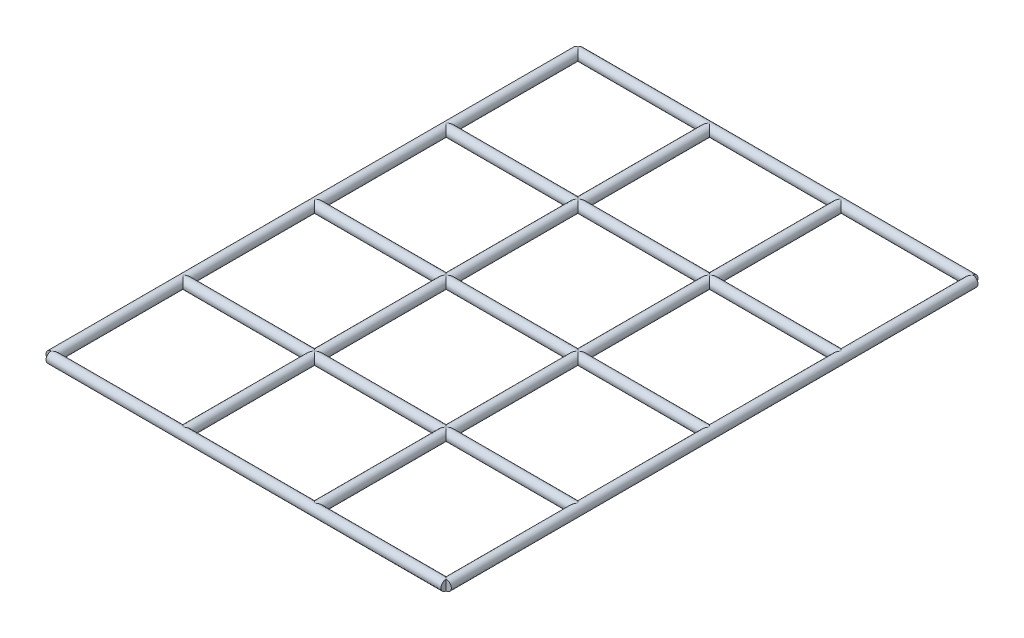
ISO-10303-21;
HEADER;
FILE_DESCRIPTION(('STEP AP214'),'2;1');
FILE_NAME('part.step','',(''),(''),'','','');
FILE_SCHEMA(('AUTOMOTIVE_DESIGN { 1 0 10303 214 1 1 1 1 }'));
ENDSEC;
DATA;
#1=APPLICATION_CONTEXT('core data for automotive mechanical design processes');
#2=APPLICATION_PROTOCOL_DEFINITION('international standard','automotive_design',2000,#1);
#3=PRODUCT_CONTEXT('',#1,'mechanical');
#4=PRODUCT('Part','Part','',(#3));
#5=PRODUCT_RELATED_PRODUCT_CATEGORY('part','',(#4));
#6=PRODUCT_DEFINITION_FORMATION('','',#4);
#7=PRODUCT_DEFINITION_CONTEXT('part definition',#1,'design');
#8=PRODUCT_DEFINITION('design','',#6,#7);
#9=PRODUCT_DEFINITION_SHAPE('','',#8);
#10=(LENGTH_UNIT() NAMED_UNIT(*) SI_UNIT(.MILLI.,.METRE.));
#11=(NAMED_UNIT(*) PLANE_ANGLE_UNIT() SI_UNIT($,.RADIAN.));
#12=(NAMED_UNIT(*) SI_UNIT($,.STERADIAN.) SOLID_ANGLE_UNIT());
#13=UNCERTAINTY_MEASURE_WITH_UNIT(LENGTH_MEASURE(1.E-05),#10,'distance_accuracy_value','');
#14=(GEOMETRIC_REPRESENTATION_CONTEXT(3) GLOBAL_UNCERTAINTY_ASSIGNED_CONTEXT((#13)) GLOBAL_UNIT_ASSIGNED_CONTEXT((#10,
#11,#12)) REPRESENTATION_CONTEXT('',''));
#15=CARTESIAN_POINT('',(0.,0.,0.));
#16=DIRECTION('',(0.,0.,1.));
#17=DIRECTION('',(1.,0.,0.));
#18=AXIS2_PLACEMENT_3D('',#15,#16,#17);
#19=CARTESIAN_POINT('',(0.,0.,-203.2));
#20=DIRECTION('',(0.,0.,1.));
#21=DIRECTION('',(1.,0.,0.));
#22=AXIS2_PLACEMENT_3D('',#19,#20,#21);
#23=CYLINDRICAL_SURFACE('',#22,1.9812);
#24=CARTESIAN_POINT('',(0.,0.,-152.4));
#25=DIRECTION('',(0.707106781186547,0.,0.707106781186548));
#26=DIRECTION('',(-0.707106781186547,0.,0.707106781186548));
#27=AXIS2_PLACEMENT_3D('',#24,#25,#26);
#28=ELLIPSE('',#27,2.80183990977358,1.9812);
#29=CARTESIAN_POINT('',(0.,1.9812,-152.4));
#30=VERTEX_POINT('',#29);
#31=CARTESIAN_POINT('',(0.,-1.9812,-152.4));
#32=VERTEX_POINT('',#31);
#33=EDGE_CURVE('E283',#30,#32,#28,.F.);
#34=ORIENTED_EDGE('',*,*,#33,.T.);
#35=CARTESIAN_POINT('',(0.,0.,-152.4));
#36=DIRECTION('',(-0.707106781186547,0.,0.707106781186548));
#37=DIRECTION('',(0.707106781186547,0.,0.707106781186548));
#38=AXIS2_PLACEMENT_3D('',#35,#36,#37);
#39=ELLIPSE('',#38,2.80183990977358,1.9812);
#40=EDGE_CURVE('E323',#32,#30,#39,.T.);
#41=ORIENTED_EDGE('',*,*,#40,.T.);
#42=EDGE_LOOP('',(#34,#41));
#43=FACE_BOUND('',#42,.T.);
#44=CARTESIAN_POINT('',(0.,0.,-50.8));
#45=DIRECTION('',(0.707106781186547,0.,0.707106781186548));
#46=DIRECTION('',(-0.707106781186547,0.,0.707106781186548));
#47=AXIS2_PLACEMENT_3D('',#44,#45,#46);
#48=ELLIPSE('',#47,2.80183990977358,1.9812);
#49=CARTESIAN_POINT('',(0.,1.9812,-50.8));
#50=VERTEX_POINT('',#49);
#51=CARTESIAN_POINT('',(0.,-1.9812,-50.8));
#52=VERTEX_POINT('',#51);
#53=EDGE_CURVE('E287',#50,#52,#48,.F.);
#54=ORIENTED_EDGE('',*,*,#53,.T.);
#55=CARTESIAN_POINT('',(0.,0.,-50.8));
#56=DIRECTION('',(-0.707106781186547,0.,0.707106781186548));
#57=DIRECTION('',(0.707106781186547,0.,0.707106781186548));
#58=AXIS2_PLACEMENT_3D('',#55,#56,#57);
#59=ELLIPSE('',#58,2.80183990977358,1.9812);
#60=EDGE_CURVE('E191',#52,#50,#59,.T.);
#61=ORIENTED_EDGE('',*,*,#60,.T.);
#62=EDGE_LOOP('',(#54,#61));
#63=FACE_BOUND('',#62,.T.);
#64=CARTESIAN_POINT('',(0.,0.,0.));
#65=DIRECTION('',(0.,0.,1.));
#66=DIRECTION('',(1.,0.,0.));
#67=AXIS2_PLACEMENT_3D('',#64,#65,#66);
#68=CIRCLE('',#67,1.9812);
#69=CARTESIAN_POINT('',(0.,1.9812,0.));
#70=VERTEX_POINT('',#69);
#71=CARTESIAN_POINT('',(0.,-1.9812,0.));
#72=VERTEX_POINT('',#71);
#73=EDGE_CURVE('E203',#70,#72,#68,.T.);
#74=ORIENTED_EDGE('',*,*,#73,.F.);
#75=CARTESIAN_POINT('',(0.,0.,0.));
#76=DIRECTION('',(0.707106781186547,0.,0.707106781186548));
#77=DIRECTION('',(-0.707106781186547,0.,0.707106781186548));
#78=AXIS2_PLACEMENT_3D('',#75,#76,#77);
#79=ELLIPSE('',#78,2.80183990977358,1.9812);
#80=EDGE_CURVE('E198',#70,#72,#79,.F.);
#81=ORIENTED_EDGE('',*,*,#80,.T.);
#82=EDGE_LOOP('',(#74,#81));
#83=FACE_BOUND('',#82,.T.);
#84=CARTESIAN_POINT('',(0.,0.,-101.6));
#85=DIRECTION('',(0.707106781186547,0.,0.707106781186548));
#86=DIRECTION('',(-0.707106781186547,0.,0.707106781186548));
#87=AXIS2_PLACEMENT_3D('',#84,#85,#86);
#88=ELLIPSE('',#87,2.80183990977358,1.9812);
#89=CARTESIAN_POINT('',(0.,1.9812,-101.6));
#90=VERTEX_POINT('',#89);
#91=CARTESIAN_POINT('',(0.,-1.9812,-101.6));
#92=VERTEX_POINT('',#91);
#93=EDGE_CURVE('E293',#90,#92,#88,.F.);
#94=ORIENTED_EDGE('',*,*,#93,.T.);
#95=CARTESIAN_POINT('',(0.,0.,-101.6));
#96=DIRECTION('',(-0.707106781186547,0.,0.707106781186548));
#97=DIRECTION('',(0.707106781186547,0.,0.707106781186548));
#98=AXIS2_PLACEMENT_3D('',#95,#96,#97);
#99=ELLIPSE('',#98,2.80183990977358,1.9812);
#100=EDGE_CURVE('E343',#92,#90,#99,.T.);
#101=ORIENTED_EDGE('',*,*,#100,.T.);
#102=EDGE_LOOP('',(#94,#101));
#103=FACE_BOUND('',#102,.T.);
#104=CARTESIAN_POINT('',(0.,0.,-203.2));
#105=DIRECTION('',(0.,0.,1.));
#106=DIRECTION('',(1.,0.,0.));
#107=AXIS2_PLACEMENT_3D('',#104,#105,#106);
#108=CIRCLE('',#107,1.9812);
#109=CARTESIAN_POINT('',(0.,1.9812,-203.2));
#110=VERTEX_POINT('',#109);
#111=CARTESIAN_POINT('',(0.,-1.9812,-203.2));
#112=VERTEX_POINT('',#111);
#113=EDGE_CURVE('E204',#110,#112,#108,.T.);
#114=ORIENTED_EDGE('',*,*,#113,.T.);
#115=CARTESIAN_POINT('',(0.,0.,-203.2));
#116=DIRECTION('',(-0.707106781186547,0.,0.707106781186548));
#117=DIRECTION('',(0.707106781186547,0.,0.707106781186548));
#118=AXIS2_PLACEMENT_3D('',#115,#116,#117);
#119=ELLIPSE('',#118,2.80183990977358,1.9812);
#120=EDGE_CURVE('E180',#112,#110,#119,.T.);
#121=ORIENTED_EDGE('',*,*,#120,.T.);
#122=EDGE_LOOP('',(#114,#121));
#123=FACE_BOUND('',#122,.T.);
#124=ADVANCED_FACE('F32',(#43,#63,#83,#103,#123),#23,.T.);
#125=CARTESIAN_POINT('',(152.4,0.,-203.2));
#126=DIRECTION('',(0.,0.,1.));
#127=DIRECTION('',(1.,0.,0.));
#128=AXIS2_PLACEMENT_3D('',#125,#126,#127);
#129=CYLINDRICAL_SURFACE('',#128,1.9812);
#130=CARTESIAN_POINT('',(152.4,0.,-152.4));
#131=DIRECTION('',(0.707106781186547,0.,0.707106781186548));
#132=DIRECTION('',(-0.707106781186547,0.,0.707106781186548));
#133=AXIS2_PLACEMENT_3D('',#130,#131,#132);
#134=ELLIPSE('',#133,2.80183990977358,1.9812);
#135=CARTESIAN_POINT('',(152.4,1.9812,-152.4));
#136=VERTEX_POINT('',#135);
#137=CARTESIAN_POINT('',(152.4,-1.9812,-152.4));
#138=VERTEX_POINT('',#137);
#139=EDGE_CURVE('E316',#136,#138,#134,.T.);
#140=ORIENTED_EDGE('',*,*,#139,.T.);
#141=CARTESIAN_POINT('',(152.4,0.,-152.4));
#142=DIRECTION('',(-0.707106781186547,0.,0.707106781186548));
#143=DIRECTION('',(0.707106781186547,0.,0.707106781186548));
#144=AXIS2_PLACEMENT_3D('',#141,#142,#143);
#145=ELLIPSE('',#144,2.80183990977358,1.9812);
#146=EDGE_CURVE('E319',#138,#136,#145,.F.);
#147=ORIENTED_EDGE('',*,*,#146,.T.);
#148=EDGE_LOOP('',(#140,#147));
#149=FACE_BOUND('',#148,.T.);
#150=CARTESIAN_POINT('',(152.4,0.,-50.8));
#151=DIRECTION('',(0.707106781186547,0.,0.707106781186548));
#152=DIRECTION('',(-0.707106781186547,0.,0.707106781186548));
#153=AXIS2_PLACEMENT_3D('',#150,#151,#152);
#154=ELLIPSE('',#153,2.80183990977358,1.9812);
#155=CARTESIAN_POINT('',(152.4,1.9812,-50.8));
#156=VERTEX_POINT('',#155);
#157=CARTESIAN_POINT('',(152.4,-1.9812,-50.8));
#158=VERTEX_POINT('',#157);
#159=EDGE_CURVE('E226',#156,#158,#154,.T.);
#160=ORIENTED_EDGE('',*,*,#159,.T.);
#161=CARTESIAN_POINT('',(152.4,0.,-50.8));
#162=DIRECTION('',(-0.707106781186547,0.,0.707106781186548));
#163=DIRECTION('',(0.707106781186547,0.,0.707106781186548));
#164=AXIS2_PLACEMENT_3D('',#161,#162,#163);
#165=ELLIPSE('',#164,2.80183990977358,1.9812);
#166=EDGE_CURVE('E229',#158,#156,#165,.F.);
#167=ORIENTED_EDGE('',*,*,#166,.T.);
#168=EDGE_LOOP('',(#160,#167));
#169=FACE_BOUND('',#168,.T.);
#170=CARTESIAN_POINT('',(152.4,0.,0.));
#171=DIRECTION('',(-0.707106781186547,0.,0.707106781186548));
#172=DIRECTION('',(-0.707106781186547,0.,-0.707106781186548));
#173=AXIS2_PLACEMENT_3D('',#170,#171,#172);
#174=ELLIPSE('',#173,2.80183990977358,1.9812);
#175=CARTESIAN_POINT('',(152.4,1.9812,0.));
#176=VERTEX_POINT('',#175);
#177=CARTESIAN_POINT('',(152.4,-1.9812,0.));
#178=VERTEX_POINT('',#177);
#179=EDGE_CURVE('E184',#176,#178,#174,.T.);
#180=ORIENTED_EDGE('',*,*,#179,.F.);
#181=CARTESIAN_POINT('',(152.4,0.,0.));
#182=DIRECTION('',(0.,0.,1.));
#183=DIRECTION('',(1.,0.,0.));
#184=AXIS2_PLACEMENT_3D('',#181,#182,#183);
#185=CIRCLE('',#184,1.9812);
#186=EDGE_CURVE('E185',#178,#176,#185,.T.);
#187=ORIENTED_EDGE('',*,*,#186,.F.);
#188=EDGE_LOOP('',(#180,#187));
#189=FACE_BOUND('',#188,.T.);
#190=CARTESIAN_POINT('',(152.4,0.,-101.6));
#191=DIRECTION('',(0.707106781186547,0.,0.707106781186548));
#192=DIRECTION('',(-0.707106781186547,0.,0.707106781186548));
#193=AXIS2_PLACEMENT_3D('',#190,#191,#192);
#194=ELLIPSE('',#193,2.80183990977358,1.9812);
#195=CARTESIAN_POINT('',(152.4,1.9812,-101.6));
#196=VERTEX_POINT('',#195);
#197=CARTESIAN_POINT('',(152.4,-1.9812,-101.6));
#198=VERTEX_POINT('',#197);
#199=EDGE_CURVE('E336',#196,#198,#194,.T.);
#200=ORIENTED_EDGE('',*,*,#199,.T.);
#201=CARTESIAN_POINT('',(152.4,0.,-101.6));
#202=DIRECTION('',(-0.707106781186547,0.,0.707106781186548));
#203=DIRECTION('',(0.707106781186547,0.,0.707106781186548));
#204=AXIS2_PLACEMENT_3D('',#201,#202,#203);
#205=ELLIPSE('',#204,2.80183990977358,1.9812);
#206=EDGE_CURVE('E339',#198,#196,#205,.F.);
#207=ORIENTED_EDGE('',*,*,#206,.T.);
#208=EDGE_LOOP('',(#200,#207));
#209=FACE_BOUND('',#208,.T.);
#210=CARTESIAN_POINT('',(152.4,0.,-203.2));
#211=DIRECTION('',(0.,0.,1.));
#212=DIRECTION('',(1.,0.,0.));
#213=AXIS2_PLACEMENT_3D('',#210,#211,#212);
#214=CIRCLE('',#213,1.9812);
#215=CARTESIAN_POINT('',(152.4,-1.9812,-203.2));
#216=VERTEX_POINT('',#215);
#217=CARTESIAN_POINT('',(152.4,1.9812,-203.2));
#218=VERTEX_POINT('',#217);
#219=EDGE_CURVE('E179',#216,#218,#214,.T.);
#220=ORIENTED_EDGE('',*,*,#219,.T.);
#221=CARTESIAN_POINT('',(152.4,0.,-203.2));
#222=DIRECTION('',(0.707106781186547,0.,0.707106781186548));
#223=DIRECTION('',(-0.707106781186547,0.,0.707106781186548));
#224=AXIS2_PLACEMENT_3D('',#221,#222,#223);
#225=ELLIPSE('',#224,2.80183990977358,1.9812);
#226=EDGE_CURVE('E173',#218,#216,#225,.T.);
#227=ORIENTED_EDGE('',*,*,#226,.T.);
#228=EDGE_LOOP('',(#220,#227));
#229=FACE_BOUND('',#228,.T.);
#230=ADVANCED_FACE('F178',(#149,#169,#189,#209,#229),#129,.T.);
#231=CARTESIAN_POINT('',(0.,0.,-203.2));
#232=DIRECTION('',(0.,0.,1.));
#233=DIRECTION('',(1.,0.,0.));
#234=AXIS2_PLACEMENT_3D('',#231,#232,#233);
#235=PLANE('',#234);
#236=DIRECTION('',(0.,1.,0.));
#237=VECTOR('',#236,1.);
#238=CARTESIAN_POINT('',(0.,0.,-203.2));
#239=LINE('',#238,#237);
#240=EDGE_CURVE('E11',#112,#110,#239,.T.);
#241=ORIENTED_EDGE('',*,*,#240,.F.);
#242=ORIENTED_EDGE('',*,*,#113,.F.);
#243=EDGE_LOOP('',(#241,#242));
#244=FACE_BOUND('',#243,.T.);
#245=ADVANCED_FACE('F277',(#244),#235,.F.);
#246=CARTESIAN_POINT('',(101.6,0.,-203.2));
#247=DIRECTION('',(0.,0.,1.));
#248=DIRECTION('',(1.,0.,0.));
#249=AXIS2_PLACEMENT_3D('',#246,#247,#248);
#250=CYLINDRICAL_SURFACE('',#249,1.9812);
#251=CARTESIAN_POINT('',(101.6,0.,-152.4));
#252=DIRECTION('',(0.707106781186547,0.,0.707106781186548));
#253=DIRECTION('',(-0.707106781186547,0.,0.707106781186548));
#254=AXIS2_PLACEMENT_3D('',#251,#252,#253);
#255=ELLIPSE('',#254,2.80183990977358,1.9812);
#256=CARTESIAN_POINT('',(101.6,1.9812,-152.4));
#257=VERTEX_POINT('',#256);
#258=CARTESIAN_POINT('',(101.6,-1.9812,-152.4));
#259=VERTEX_POINT('',#258);
#260=EDGE_CURVE('E297',#257,#259,#255,.F.);
#261=ORIENTED_EDGE('',*,*,#260,.T.);
#262=CARTESIAN_POINT('',(101.6,0.,-152.4));
#263=DIRECTION('',(-0.707106781186547,0.,0.707106781186548));
#264=DIRECTION('',(0.707106781186547,0.,0.707106781186548));
#265=AXIS2_PLACEMENT_3D('',#262,#263,#264);
#266=ELLIPSE('',#265,2.80183990977358,1.9812);
#267=EDGE_CURVE('E313',#259,#257,#266,.F.);
#268=ORIENTED_EDGE('',*,*,#267,.T.);
#269=EDGE_LOOP('',(#261,#268));
#270=FACE_BOUND('',#269,.T.);
#271=CARTESIAN_POINT('',(101.6,0.,-203.2));
#272=DIRECTION('',(0.707106781186547,0.,0.707106781186548));
#273=DIRECTION('',(-0.707106781186547,0.,0.707106781186548));
#274=AXIS2_PLACEMENT_3D('',#271,#272,#273);
#275=ELLIPSE('',#274,2.80183990977358,1.9812);
#276=CARTESIAN_POINT('',(101.6,1.9812,-203.2));
#277=VERTEX_POINT('',#276);
#278=CARTESIAN_POINT('',(101.6,-1.9812,-203.2));
#279=VERTEX_POINT('',#278);
#280=EDGE_CURVE('E174',#277,#279,#275,.T.);
#281=ORIENTED_EDGE('',*,*,#280,.T.);
#282=CARTESIAN_POINT('',(101.6,0.,-203.2));
#283=DIRECTION('',(-0.707106781186547,0.,0.707106781186548));
#284=DIRECTION('',(0.707106781186547,0.,0.707106781186548));
#285=AXIS2_PLACEMENT_3D('',#282,#283,#284);
#286=ELLIPSE('',#285,2.80183990977358,1.9812);
#287=EDGE_CURVE('E181',#279,#277,#286,.T.);
#288=ORIENTED_EDGE('',*,*,#287,.T.);
#289=EDGE_LOOP('',(#281,#288));
#290=FACE_BOUND('',#289,.T.);
#291=ADVANCED_FACE('F407',(#270,#290),#250,.T.);
#292=CARTESIAN_POINT('',(50.8,0.,-203.2));
#293=DIRECTION('',(0.,0.,1.));
#294=DIRECTION('',(1.,0.,0.));
#295=AXIS2_PLACEMENT_3D('',#292,#293,#294);
#296=CYLINDRICAL_SURFACE('',#295,1.9812);
#297=CARTESIAN_POINT('',(50.8,0.,-152.4));
#298=DIRECTION('',(0.707106781186547,0.,0.707106781186548));
#299=DIRECTION('',(-0.707106781186547,0.,0.707106781186548));
#300=AXIS2_PLACEMENT_3D('',#297,#298,#299);
#301=ELLIPSE('',#300,2.80183990977358,1.9812);
#302=CARTESIAN_POINT('',(50.8,1.9812,-152.4));
#303=VERTEX_POINT('',#302);
#304=CARTESIAN_POINT('',(50.8,-1.9812,-152.4));
#305=VERTEX_POINT('',#304);
#306=EDGE_CURVE('E243',#303,#305,#301,.F.);
#307=ORIENTED_EDGE('',*,*,#306,.T.);
#308=CARTESIAN_POINT('',(50.8,0.,-152.4));
#309=DIRECTION('',(-0.707106781186547,0.,0.707106781186548));
#310=DIRECTION('',(0.707106781186547,0.,0.707106781186548));
#311=AXIS2_PLACEMENT_3D('',#308,#309,#310);
#312=ELLIPSE('',#311,2.80183990977358,1.9812);
#313=EDGE_CURVE('E251',#305,#303,#312,.F.);
#314=ORIENTED_EDGE('',*,*,#313,.T.);
#315=EDGE_LOOP('',(#307,#314));
#316=FACE_BOUND('',#315,.T.);
#317=CARTESIAN_POINT('',(50.8,0.,-203.2));
#318=DIRECTION('',(0.707106781186547,0.,0.707106781186548));
#319=DIRECTION('',(-0.707106781186547,0.,0.707106781186548));
#320=AXIS2_PLACEMENT_3D('',#317,#318,#319);
#321=ELLIPSE('',#320,2.80183990977358,1.9812);
#322=CARTESIAN_POINT('',(50.8,1.9812,-203.2));
#323=VERTEX_POINT('',#322);
#324=CARTESIAN_POINT('',(50.8,-1.9812,-203.2));
#325=VERTEX_POINT('',#324);
#326=EDGE_CURVE('E254',#323,#325,#321,.T.);
#327=ORIENTED_EDGE('',*,*,#326,.T.);
#328=CARTESIAN_POINT('',(50.8,0.,-203.2));
#329=DIRECTION('',(-0.707106781186547,0.,0.707106781186548));
#330=DIRECTION('',(0.707106781186547,0.,0.707106781186548));
#331=AXIS2_PLACEMENT_3D('',#328,#329,#330);
#332=ELLIPSE('',#331,2.80183990977358,1.9812);
#333=EDGE_CURVE('E168',#325,#323,#332,.T.);
#334=ORIENTED_EDGE('',*,*,#333,.T.);
#335=EDGE_LOOP('',(#327,#334));
#336=FACE_BOUND('',#335,.T.);
#337=ADVANCED_FACE('F259',(#316,#336),#296,.T.);
#338=CARTESIAN_POINT('',(101.6,0.,-101.6));
#339=DIRECTION('',(0.707106781186547,0.,0.707106781186548));
#340=DIRECTION('',(-0.707106781186547,0.,0.707106781186548));
#341=AXIS2_PLACEMENT_3D('',#338,#339,#340);
#342=ELLIPSE('',#341,2.80183990977358,1.9812);
#343=CARTESIAN_POINT('',(101.6,1.9812,-101.6));
#344=VERTEX_POINT('',#343);
#345=CARTESIAN_POINT('',(101.6,-1.9812,-101.6));
#346=VERTEX_POINT('',#345);
#347=EDGE_CURVE('E325',#344,#346,#342,.F.);
#348=ORIENTED_EDGE('',*,*,#347,.T.);
#349=CARTESIAN_POINT('',(101.6,0.,-101.6));
#350=DIRECTION('',(-0.707106781186547,0.,0.707106781186548));
#351=DIRECTION('',(0.707106781186547,0.,0.707106781186548));
#352=AXIS2_PLACEMENT_3D('',#349,#350,#351);
#353=ELLIPSE('',#352,2.80183990977358,1.9812);
#354=EDGE_CURVE('E333',#346,#344,#353,.F.);
#355=ORIENTED_EDGE('',*,*,#354,.T.);
#356=EDGE_LOOP('',(#348,#355));
#357=FACE_BOUND('',#356,.T.);
#358=CARTESIAN_POINT('',(101.6,0.,-152.4));
#359=DIRECTION('',(0.707106781186547,0.,0.707106781186548));
#360=DIRECTION('',(-0.707106781186547,0.,0.707106781186548));
#361=AXIS2_PLACEMENT_3D('',#358,#359,#360);
#362=ELLIPSE('',#361,2.80183990977358,1.9812);
#363=EDGE_CURVE('E307',#257,#259,#362,.T.);
#364=ORIENTED_EDGE('',*,*,#363,.T.);
#365=CARTESIAN_POINT('',(101.6,0.,-152.4));
#366=DIRECTION('',(-0.707106781186547,0.,0.707106781186548));
#367=DIRECTION('',(0.707106781186547,0.,0.707106781186548));
#368=AXIS2_PLACEMENT_3D('',#365,#366,#367);
#369=ELLIPSE('',#368,2.80183990977358,1.9812);
#370=EDGE_CURVE('E310',#259,#257,#369,.T.);
#371=ORIENTED_EDGE('',*,*,#370,.T.);
#372=EDGE_LOOP('',(#364,#371));
#373=FACE_BOUND('',#372,.T.);
#374=ADVANCED_FACE('F397',(#357,#373),#250,.T.);
#375=CARTESIAN_POINT('',(50.8,0.,-101.6));
#376=DIRECTION('',(0.707106781186547,0.,0.707106781186548));
#377=DIRECTION('',(-0.707106781186547,0.,0.707106781186548));
#378=AXIS2_PLACEMENT_3D('',#375,#376,#377);
#379=ELLIPSE('',#378,2.80183990977358,1.9812);
#380=CARTESIAN_POINT('',(50.8,1.9812,-101.6));
#381=VERTEX_POINT('',#380);
#382=CARTESIAN_POINT('',(50.8,-1.9812,-101.6));
#383=VERTEX_POINT('',#382);
#384=EDGE_CURVE('E232',#381,#383,#379,.F.);
#385=ORIENTED_EDGE('',*,*,#384,.T.);
#386=CARTESIAN_POINT('',(50.8,0.,-101.6));
#387=DIRECTION('',(-0.707106781186547,0.,0.707106781186548));
#388=DIRECTION('',(0.707106781186547,0.,0.707106781186548));
#389=AXIS2_PLACEMENT_3D('',#386,#387,#388);
#390=ELLIPSE('',#389,2.80183990977358,1.9812);
#391=EDGE_CURVE('E240',#383,#381,#390,.F.);
#392=ORIENTED_EDGE('',*,*,#391,.T.);
#393=EDGE_LOOP('',(#385,#392));
#394=FACE_BOUND('',#393,.T.);
#395=CARTESIAN_POINT('',(50.8,0.,-152.4));
#396=DIRECTION('',(0.707106781186547,0.,0.707106781186548));
#397=DIRECTION('',(-0.707106781186547,0.,0.707106781186548));
#398=AXIS2_PLACEMENT_3D('',#395,#396,#397);
#399=ELLIPSE('',#398,2.80183990977358,1.9812);
#400=EDGE_CURVE('E245',#303,#305,#399,.T.);
#401=ORIENTED_EDGE('',*,*,#400,.T.);
#402=CARTESIAN_POINT('',(50.8,0.,-152.4));
#403=DIRECTION('',(-0.707106781186547,0.,0.707106781186548));
#404=DIRECTION('',(0.707106781186547,0.,0.707106781186548));
#405=AXIS2_PLACEMENT_3D('',#402,#403,#404);
#406=ELLIPSE('',#405,2.80183990977358,1.9812);
#407=EDGE_CURVE('E248',#305,#303,#406,.T.);
#408=ORIENTED_EDGE('',*,*,#407,.T.);
#409=EDGE_LOOP('',(#401,#408));
#410=FACE_BOUND('',#409,.T.);
#411=ADVANCED_FACE('F387',(#394,#410),#296,.T.);
#412=CARTESIAN_POINT('',(101.6,0.,-50.8));
#413=DIRECTION('',(0.707106781186547,0.,0.707106781186548));
#414=DIRECTION('',(-0.707106781186547,0.,0.707106781186548));
#415=AXIS2_PLACEMENT_3D('',#412,#413,#414);
#416=ELLIPSE('',#415,2.80183990977358,1.9812);
#417=CARTESIAN_POINT('',(101.6,1.9812,-50.8));
#418=VERTEX_POINT('',#417);
#419=CARTESIAN_POINT('',(101.6,-1.9812,-50.8));
#420=VERTEX_POINT('',#419);
#421=EDGE_CURVE('E345',#418,#420,#416,.F.);
#422=ORIENTED_EDGE('',*,*,#421,.T.);
#423=CARTESIAN_POINT('',(101.6,0.,-50.8));
#424=DIRECTION('',(-0.707106781186547,0.,0.707106781186548));
#425=DIRECTION('',(0.707106781186547,0.,0.707106781186548));
#426=AXIS2_PLACEMENT_3D('',#423,#424,#425);
#427=ELLIPSE('',#426,2.80183990977358,1.9812);
#428=EDGE_CURVE('E353',#420,#418,#427,.F.);
#429=ORIENTED_EDGE('',*,*,#428,.T.);
#430=EDGE_LOOP('',(#422,#429));
#431=FACE_BOUND('',#430,.T.);
#432=CARTESIAN_POINT('',(101.6,0.,-101.6));
#433=DIRECTION('',(0.707106781186547,0.,0.707106781186548));
#434=DIRECTION('',(-0.707106781186547,0.,0.707106781186548));
#435=AXIS2_PLACEMENT_3D('',#432,#433,#434);
#436=ELLIPSE('',#435,2.80183990977358,1.9812);
#437=EDGE_CURVE('E327',#344,#346,#436,.T.);
#438=ORIENTED_EDGE('',*,*,#437,.T.);
#439=CARTESIAN_POINT('',(101.6,0.,-101.6));
#440=DIRECTION('',(-0.707106781186547,0.,0.707106781186548));
#441=DIRECTION('',(0.707106781186547,0.,0.707106781186548));
#442=AXIS2_PLACEMENT_3D('',#439,#440,#441);
#443=ELLIPSE('',#442,2.80183990977358,1.9812);
#444=EDGE_CURVE('E330',#346,#344,#443,.T.);
#445=ORIENTED_EDGE('',*,*,#444,.T.);
#446=EDGE_LOOP('',(#438,#445));
#447=FACE_BOUND('',#446,.T.);
#448=ADVANCED_FACE('F385',(#431,#447),#250,.T.);
#449=CARTESIAN_POINT('',(50.8,0.,-50.8));
#450=DIRECTION('',(0.707106781186547,0.,0.707106781186548));
#451=DIRECTION('',(-0.707106781186547,0.,0.707106781186548));
#452=AXIS2_PLACEMENT_3D('',#449,#450,#451);
#453=ELLIPSE('',#452,2.80183990977358,1.9812);
#454=CARTESIAN_POINT('',(50.8,1.9812,-50.8));
#455=VERTEX_POINT('',#454);
#456=CARTESIAN_POINT('',(50.8,-1.9812,-50.8));
#457=VERTEX_POINT('',#456);
#458=EDGE_CURVE('E356',#455,#457,#453,.F.);
#459=ORIENTED_EDGE('',*,*,#458,.T.);
#460=CARTESIAN_POINT('',(50.8,0.,-50.8));
#461=DIRECTION('',(-0.707106781186547,0.,0.707106781186548));
#462=DIRECTION('',(0.707106781186547,0.,0.707106781186548));
#463=AXIS2_PLACEMENT_3D('',#460,#461,#462);
#464=ELLIPSE('',#463,2.80183990977358,1.9812);
#465=EDGE_CURVE('E364',#457,#455,#464,.F.);
#466=ORIENTED_EDGE('',*,*,#465,.T.);
#467=EDGE_LOOP('',(#459,#466));
#468=FACE_BOUND('',#467,.T.);
#469=CARTESIAN_POINT('',(50.8,0.,-101.6));
#470=DIRECTION('',(0.707106781186547,0.,0.707106781186548));
#471=DIRECTION('',(-0.707106781186547,0.,0.707106781186548));
#472=AXIS2_PLACEMENT_3D('',#469,#470,#471);
#473=ELLIPSE('',#472,2.80183990977358,1.9812);
#474=EDGE_CURVE('E234',#381,#383,#473,.T.);
#475=ORIENTED_EDGE('',*,*,#474,.T.);
#476=CARTESIAN_POINT('',(50.8,0.,-101.6));
#477=DIRECTION('',(-0.707106781186547,0.,0.707106781186548));
#478=DIRECTION('',(0.707106781186547,0.,0.707106781186548));
#479=AXIS2_PLACEMENT_3D('',#476,#477,#478);
#480=ELLIPSE('',#479,2.80183990977358,1.9812);
#481=EDGE_CURVE('E237',#383,#381,#480,.T.);
#482=ORIENTED_EDGE('',*,*,#481,.T.);
#483=EDGE_LOOP('',(#475,#482));
#484=FACE_BOUND('',#483,.T.);
#485=ADVANCED_FACE('F382',(#468,#484),#296,.T.);
#486=CARTESIAN_POINT('',(50.8,0.,0.));
#487=DIRECTION('',(-0.707106781186547,0.,0.707106781186548));
#488=DIRECTION('',(-0.707106781186547,0.,-0.707106781186548));
#489=AXIS2_PLACEMENT_3D('',#486,#487,#488);
#490=ELLIPSE('',#489,2.80183990977358,1.9812);
#491=CARTESIAN_POINT('',(50.8,1.9812,0.));
#492=VERTEX_POINT('',#491);
#493=CARTESIAN_POINT('',(50.8,-1.9812,0.));
#494=VERTEX_POINT('',#493);
#495=EDGE_CURVE('E214',#492,#494,#490,.T.);
#496=ORIENTED_EDGE('',*,*,#495,.F.);
#497=CARTESIAN_POINT('',(50.8,0.,0.));
#498=DIRECTION('',(-0.707106781186547,0.,-0.707106781186548));
#499=DIRECTION('',(-0.707106781186547,0.,0.707106781186548));
#500=AXIS2_PLACEMENT_3D('',#497,#498,#499);
#501=ELLIPSE('',#500,2.80183990977358,1.9812);
#502=EDGE_CURVE('E211',#494,#492,#501,.F.);
#503=ORIENTED_EDGE('',*,*,#502,.F.);
#504=EDGE_LOOP('',(#496,#503));
#505=FACE_BOUND('',#504,.T.);
#506=CARTESIAN_POINT('',(50.8,0.,-50.8));
#507=DIRECTION('',(0.707106781186547,0.,0.707106781186548));
#508=DIRECTION('',(-0.707106781186547,0.,0.707106781186548));
#509=AXIS2_PLACEMENT_3D('',#506,#507,#508);
#510=ELLIPSE('',#509,2.80183990977358,1.9812);
#511=EDGE_CURVE('E358',#455,#457,#510,.T.);
#512=ORIENTED_EDGE('',*,*,#511,.T.);
#513=CARTESIAN_POINT('',(50.8,0.,-50.8));
#514=DIRECTION('',(-0.707106781186547,0.,0.707106781186548));
#515=DIRECTION('',(0.707106781186547,0.,0.707106781186548));
#516=AXIS2_PLACEMENT_3D('',#513,#514,#515);
#517=ELLIPSE('',#516,2.80183990977358,1.9812);
#518=EDGE_CURVE('E361',#457,#455,#517,.T.);
#519=ORIENTED_EDGE('',*,*,#518,.T.);
#520=EDGE_LOOP('',(#512,#519));
#521=FACE_BOUND('',#520,.T.);
#522=ADVANCED_FACE('F378',(#505,#521),#296,.T.);
#523=CARTESIAN_POINT('',(101.6,0.,0.));
#524=DIRECTION('',(-0.707106781186547,0.,0.707106781186548));
#525=DIRECTION('',(-0.707106781186547,0.,-0.707106781186548));
#526=AXIS2_PLACEMENT_3D('',#523,#524,#525);
#527=ELLIPSE('',#526,2.80183990977358,1.9812);
#528=CARTESIAN_POINT('',(101.6,1.9812,0.));
#529=VERTEX_POINT('',#528);
#530=CARTESIAN_POINT('',(101.6,-1.9812,0.));
#531=VERTEX_POINT('',#530);
#532=EDGE_CURVE('E220',#529,#531,#527,.T.);
#533=ORIENTED_EDGE('',*,*,#532,.F.);
#534=CARTESIAN_POINT('',(101.6,0.,0.));
#535=DIRECTION('',(-0.707106781186547,0.,-0.707106781186548));
#536=DIRECTION('',(-0.707106781186547,0.,0.707106781186548));
#537=AXIS2_PLACEMENT_3D('',#534,#535,#536);
#538=ELLIPSE('',#537,2.80183990977358,1.9812);
#539=EDGE_CURVE('E217',#531,#529,#538,.F.);
#540=ORIENTED_EDGE('',*,*,#539,.F.);
#541=EDGE_LOOP('',(#533,#540));
#542=FACE_BOUND('',#541,.T.);
#543=CARTESIAN_POINT('',(101.6,0.,-50.8));
#544=DIRECTION('',(0.707106781186547,0.,0.707106781186548));
#545=DIRECTION('',(-0.707106781186547,0.,0.707106781186548));
#546=AXIS2_PLACEMENT_3D('',#543,#544,#545);
#547=ELLIPSE('',#546,2.80183990977358,1.9812);
#548=EDGE_CURVE('E347',#418,#420,#547,.T.);
#549=ORIENTED_EDGE('',*,*,#548,.T.);
#550=CARTESIAN_POINT('',(101.6,0.,-50.8));
#551=DIRECTION('',(-0.707106781186547,0.,0.707106781186548));
#552=DIRECTION('',(0.707106781186547,0.,0.707106781186548));
#553=AXIS2_PLACEMENT_3D('',#550,#551,#552);
#554=ELLIPSE('',#553,2.80183990977358,1.9812);
#555=EDGE_CURVE('E350',#420,#418,#554,.T.);
#556=ORIENTED_EDGE('',*,*,#555,.T.);
#557=EDGE_LOOP('',(#549,#556));
#558=FACE_BOUND('',#557,.T.);
#559=ADVANCED_FACE('F415',(#542,#558),#250,.T.);
#560=CARTESIAN_POINT('',(0.,0.,0.));
#561=DIRECTION('',(0.,0.,1.));
#562=DIRECTION('',(1.,0.,0.));
#563=AXIS2_PLACEMENT_3D('',#560,#561,#562);
#564=PLANE('',#563);
#565=ORIENTED_EDGE('',*,*,#73,.T.);
#566=DIRECTION('',(0.,1.,0.));
#567=VECTOR('',#566,1.);
#568=CARTESIAN_POINT('',(0.,0.,0.));
#569=LINE('',#568,#567);
#570=EDGE_CURVE('E206',#72,#70,#569,.T.);
#571=ORIENTED_EDGE('',*,*,#570,.T.);
#572=EDGE_LOOP('',(#565,#571));
#573=FACE_BOUND('',#572,.T.);
#574=ADVANCED_FACE('F422',(#573),#564,.T.);
#575=CARTESIAN_POINT('',(152.4,0.,0.));
#576=DIRECTION('',(-1.,0.,0.));
#577=DIRECTION('',(0.,0.,1.));
#578=AXIS2_PLACEMENT_3D('',#575,#576,#577);
#579=CYLINDRICAL_SURFACE('',#578,1.9812);
#580=ORIENTED_EDGE('',*,*,#539,.T.);
#581=ORIENTED_EDGE('',*,*,#532,.T.);
#582=EDGE_LOOP('',(#580,#581));
#583=FACE_BOUND('',#582,.T.);
#584=ORIENTED_EDGE('',*,*,#502,.T.);
#585=ORIENTED_EDGE('',*,*,#495,.T.);
#586=EDGE_LOOP('',(#584,#585));
#587=FACE_BOUND('',#586,.T.);
#588=ORIENTED_EDGE('',*,*,#80,.F.);
#589=CARTESIAN_POINT('',(0.,0.,0.));
#590=DIRECTION('',(1.,0.,0.));
#591=DIRECTION('',(0.,0.,-1.));
#592=AXIS2_PLACEMENT_3D('',#589,#590,#591);
#593=CIRCLE('',#592,1.9812);
#594=EDGE_CURVE('E188',#70,#72,#593,.T.);
#595=ORIENTED_EDGE('',*,*,#594,.T.);
#596=EDGE_LOOP('',(#588,#595));
#597=FACE_BOUND('',#596,.T.);
#598=CARTESIAN_POINT('',(152.4,0.,0.));
#599=DIRECTION('',(1.,0.,0.));
#600=DIRECTION('',(0.,0.,-1.));
#601=AXIS2_PLACEMENT_3D('',#598,#599,#600);
#602=CIRCLE('',#601,1.9812);
#603=EDGE_CURVE('E196',#176,#178,#602,.T.);
#604=ORIENTED_EDGE('',*,*,#603,.F.);
#605=ORIENTED_EDGE('',*,*,#179,.T.);
#606=EDGE_LOOP('',(#604,#605));
#607=FACE_BOUND('',#606,.T.);
#608=ADVANCED_FACE('F425',(#583,#587,#597,#607),#579,.T.);
#609=CARTESIAN_POINT('',(152.4,0.,0.));
#610=DIRECTION('',(1.,0.,0.));
#611=DIRECTION('',(0.,0.,-1.));
#612=AXIS2_PLACEMENT_3D('',#609,#610,#611);
#613=PLANE('',#612);
#614=DIRECTION('',(0.,-1.,0.));
#615=VECTOR('',#614,1.);
#616=CARTESIAN_POINT('',(152.4,0.,0.));
#617=LINE('',#616,#615);
#618=EDGE_CURVE('E223',#176,#178,#617,.T.);
#619=ORIENTED_EDGE('',*,*,#618,.F.);
#620=ORIENTED_EDGE('',*,*,#603,.T.);
#621=EDGE_LOOP('',(#619,#620));
#622=FACE_BOUND('',#621,.T.);
#623=ADVANCED_FACE('F428',(#622),#613,.T.);
#624=CARTESIAN_POINT('',(0.,0.,0.));
#625=DIRECTION('',(1.,0.,0.));
#626=DIRECTION('',(0.,0.,-1.));
#627=AXIS2_PLACEMENT_3D('',#624,#625,#626);
#628=PLANE('',#627);
#629=ORIENTED_EDGE('',*,*,#570,.F.);
#630=ORIENTED_EDGE('',*,*,#594,.F.);
#631=EDGE_LOOP('',(#629,#630));
#632=FACE_BOUND('',#631,.T.);
#633=ADVANCED_FACE('F442',(#632),#628,.F.);
#634=CARTESIAN_POINT('',(152.4,0.,-203.2));
#635=DIRECTION('',(0.,0.,1.));
#636=DIRECTION('',(1.,0.,0.));
#637=AXIS2_PLACEMENT_3D('',#634,#635,#636);
#638=PLANE('',#637);
#639=ORIENTED_EDGE('',*,*,#219,.F.);
#640=DIRECTION('',(0.,1.,0.));
#641=VECTOR('',#640,1.);
#642=CARTESIAN_POINT('',(152.4,0.,-203.2));
#643=LINE('',#642,#641);
#644=EDGE_CURVE('E39',#216,#218,#643,.T.);
#645=ORIENTED_EDGE('',*,*,#644,.T.);
#646=EDGE_LOOP('',(#639,#645));
#647=FACE_BOUND('',#646,.T.);
#648=ADVANCED_FACE('F183',(#647),#638,.F.);
#649=CARTESIAN_POINT('',(152.4,0.,0.));
#650=DIRECTION('',(0.,0.,1.));
#651=DIRECTION('',(1.,0.,0.));
#652=AXIS2_PLACEMENT_3D('',#649,#650,#651);
#653=PLANE('',#652);
#654=ORIENTED_EDGE('',*,*,#186,.T.);
#655=ORIENTED_EDGE('',*,*,#618,.T.);
#656=EDGE_LOOP('',(#654,#655));
#657=FACE_BOUND('',#656,.T.);
#658=ADVANCED_FACE('F440',(#657),#653,.T.);
#659=CARTESIAN_POINT('',(152.4,0.,-50.8));
#660=DIRECTION('',(-1.,0.,0.));
#661=DIRECTION('',(0.,0.,1.));
#662=AXIS2_PLACEMENT_3D('',#659,#660,#661);
#663=CYLINDRICAL_SURFACE('',#662,1.9812);
#664=ORIENTED_EDGE('',*,*,#555,.F.);
#665=ORIENTED_EDGE('',*,*,#421,.F.);
#666=EDGE_LOOP('',(#664,#665));
#667=FACE_BOUND('',#666,.T.);
#668=ORIENTED_EDGE('',*,*,#166,.F.);
#669=ORIENTED_EDGE('',*,*,#159,.F.);
#670=EDGE_LOOP('',(#668,#669));
#671=FACE_BOUND('',#670,.T.);
#672=ADVANCED_FACE('F373',(#667,#671),#663,.T.);
#673=ORIENTED_EDGE('',*,*,#518,.F.);
#674=ORIENTED_EDGE('',*,*,#458,.F.);
#675=EDGE_LOOP('',(#673,#674));
#676=FACE_BOUND('',#675,.T.);
#677=ORIENTED_EDGE('',*,*,#428,.F.);
#678=ORIENTED_EDGE('',*,*,#548,.F.);
#679=EDGE_LOOP('',(#677,#678));
#680=FACE_BOUND('',#679,.T.);
#681=ADVANCED_FACE('F371',(#676,#680),#663,.T.);
#682=ORIENTED_EDGE('',*,*,#60,.F.);
#683=ORIENTED_EDGE('',*,*,#53,.F.);
#684=EDGE_LOOP('',(#682,#683));
#685=FACE_BOUND('',#684,.T.);
#686=ORIENTED_EDGE('',*,*,#465,.F.);
#687=ORIENTED_EDGE('',*,*,#511,.F.);
#688=EDGE_LOOP('',(#686,#687));
#689=FACE_BOUND('',#688,.T.);
#690=ADVANCED_FACE('F367',(#685,#689),#663,.T.);
#691=CARTESIAN_POINT('',(152.4,0.,-101.6));
#692=DIRECTION('',(-1.,0.,0.));
#693=DIRECTION('',(0.,0.,1.));
#694=AXIS2_PLACEMENT_3D('',#691,#692,#693);
#695=CYLINDRICAL_SURFACE('',#694,1.9812);
#696=ORIENTED_EDGE('',*,*,#354,.F.);
#697=ORIENTED_EDGE('',*,*,#437,.F.);
#698=EDGE_LOOP('',(#696,#697));
#699=FACE_BOUND('',#698,.T.);
#700=ORIENTED_EDGE('',*,*,#481,.F.);
#701=ORIENTED_EDGE('',*,*,#384,.F.);
#702=EDGE_LOOP('',(#700,#701));
#703=FACE_BOUND('',#702,.T.);
#704=ADVANCED_FACE('F370',(#699,#703),#695,.T.);
#705=ORIENTED_EDGE('',*,*,#100,.F.);
#706=ORIENTED_EDGE('',*,*,#93,.F.);
#707=EDGE_LOOP('',(#705,#706));
#708=FACE_BOUND('',#707,.T.);
#709=ORIENTED_EDGE('',*,*,#391,.F.);
#710=ORIENTED_EDGE('',*,*,#474,.F.);
#711=EDGE_LOOP('',(#709,#710));
#712=FACE_BOUND('',#711,.T.);
#713=ADVANCED_FACE('F392',(#708,#712),#695,.T.);
#714=ORIENTED_EDGE('',*,*,#206,.F.);
#715=ORIENTED_EDGE('',*,*,#199,.F.);
#716=EDGE_LOOP('',(#714,#715));
#717=FACE_BOUND('',#716,.T.);
#718=ORIENTED_EDGE('',*,*,#444,.F.);
#719=ORIENTED_EDGE('',*,*,#347,.F.);
#720=EDGE_LOOP('',(#718,#719));
#721=FACE_BOUND('',#720,.T.);
#722=ADVANCED_FACE('F575',(#717,#721),#695,.T.);
#723=CARTESIAN_POINT('',(152.4,0.,-152.4));
#724=DIRECTION('',(-1.,0.,0.));
#725=DIRECTION('',(0.,0.,1.));
#726=AXIS2_PLACEMENT_3D('',#723,#724,#725);
#727=CYLINDRICAL_SURFACE('',#726,1.9812);
#728=ORIENTED_EDGE('',*,*,#267,.F.);
#729=ORIENTED_EDGE('',*,*,#363,.F.);
#730=EDGE_LOOP('',(#728,#729));
#731=FACE_BOUND('',#730,.T.);
#732=ORIENTED_EDGE('',*,*,#407,.F.);
#733=ORIENTED_EDGE('',*,*,#306,.F.);
#734=EDGE_LOOP('',(#732,#733));
#735=FACE_BOUND('',#734,.T.);
#736=ADVANCED_FACE('F404',(#731,#735),#727,.T.);
#737=ORIENTED_EDGE('',*,*,#40,.F.);
#738=ORIENTED_EDGE('',*,*,#33,.F.);
#739=EDGE_LOOP('',(#737,#738));
#740=FACE_BOUND('',#739,.T.);
#741=ORIENTED_EDGE('',*,*,#313,.F.);
#742=ORIENTED_EDGE('',*,*,#400,.F.);
#743=EDGE_LOOP('',(#741,#742));
#744=FACE_BOUND('',#743,.T.);
#745=ADVANCED_FACE('F402',(#740,#744),#727,.T.);
#746=ORIENTED_EDGE('',*,*,#146,.F.);
#747=ORIENTED_EDGE('',*,*,#139,.F.);
#748=EDGE_LOOP('',(#746,#747));
#749=FACE_BOUND('',#748,.T.);
#750=ORIENTED_EDGE('',*,*,#370,.F.);
#751=ORIENTED_EDGE('',*,*,#260,.F.);
#752=EDGE_LOOP('',(#750,#751));
#753=FACE_BOUND('',#752,.T.);
#754=ADVANCED_FACE('F600',(#749,#753),#727,.T.);
#755=CARTESIAN_POINT('',(0.,0.,-203.2));
#756=DIRECTION('',(1.,0.,0.));
#757=DIRECTION('',(0.,0.,-1.));
#758=AXIS2_PLACEMENT_3D('',#755,#756,#757);
#759=PLANE('',#758);
#760=CARTESIAN_POINT('',(0.,0.,-203.2));
#761=DIRECTION('',(1.,0.,0.));
#762=DIRECTION('',(0.,0.,-1.));
#763=AXIS2_PLACEMENT_3D('',#760,#761,#762);
#764=CIRCLE('',#763,1.9812);
#765=EDGE_CURVE('E175',#112,#110,#764,.T.);
#766=ORIENTED_EDGE('',*,*,#765,.F.);
#767=ORIENTED_EDGE('',*,*,#240,.T.);
#768=EDGE_LOOP('',(#766,#767));
#769=FACE_BOUND('',#768,.T.);
#770=ADVANCED_FACE('F267',(#769),#759,.F.);
#771=CARTESIAN_POINT('',(152.4,0.,-203.2));
#772=DIRECTION('',(1.,0.,0.));
#773=DIRECTION('',(0.,0.,-1.));
#774=AXIS2_PLACEMENT_3D('',#771,#772,#773);
#775=PLANE('',#774);
#776=ORIENTED_EDGE('',*,*,#644,.F.);
#777=CARTESIAN_POINT('',(152.4,0.,-203.2));
#778=DIRECTION('',(1.,0.,0.));
#779=DIRECTION('',(0.,0.,-1.));
#780=AXIS2_PLACEMENT_3D('',#777,#778,#779);
#781=CIRCLE('',#780,1.9812);
#782=EDGE_CURVE('E50',#216,#218,#781,.T.);
#783=ORIENTED_EDGE('',*,*,#782,.T.);
#784=EDGE_LOOP('',(#776,#783));
#785=FACE_BOUND('',#784,.T.);
#786=ADVANCED_FACE('F164',(#785),#775,.T.);
#787=CARTESIAN_POINT('',(152.4,0.,-203.2));
#788=DIRECTION('',(-1.,0.,0.));
#789=DIRECTION('',(0.,0.,1.));
#790=AXIS2_PLACEMENT_3D('',#787,#788,#789);
#791=CYLINDRICAL_SURFACE('',#790,1.9812);
#792=ORIENTED_EDGE('',*,*,#120,.F.);
#793=ORIENTED_EDGE('',*,*,#765,.T.);
#794=EDGE_LOOP('',(#792,#793));
#795=FACE_BOUND('',#794,.T.);
#796=ORIENTED_EDGE('',*,*,#226,.F.);
#797=ORIENTED_EDGE('',*,*,#782,.F.);
#798=EDGE_LOOP('',(#796,#797));
#799=FACE_BOUND('',#798,.T.);
#800=ORIENTED_EDGE('',*,*,#287,.F.);
#801=ORIENTED_EDGE('',*,*,#280,.F.);
#802=EDGE_LOOP('',(#800,#801));
#803=FACE_BOUND('',#802,.T.);
#804=ORIENTED_EDGE('',*,*,#333,.F.);
#805=ORIENTED_EDGE('',*,*,#326,.F.);
#806=EDGE_LOOP('',(#804,#805));
#807=FACE_BOUND('',#806,.T.);
#808=ADVANCED_FACE('F171',(#795,#799,#803,#807),#791,.T.);
#809=CLOSED_SHELL('',(#124,#230,#245,#291,#337,#374,#411,#448,#485,#522,#559,#574,#608,#623,
#633,#648,#658,#672,#681,#690,#704,#713,#722,#736,#745,#754,#770,#786,#808));
#810=MANIFOLD_SOLID_BREP('B2',#809);
#811=ADVANCED_BREP_SHAPE_REPRESENTATION('',(#18,#810),#14);
#812=SHAPE_DEFINITION_REPRESENTATION(#9,#811);
ENDSEC;
END-ISO-10303-21;
